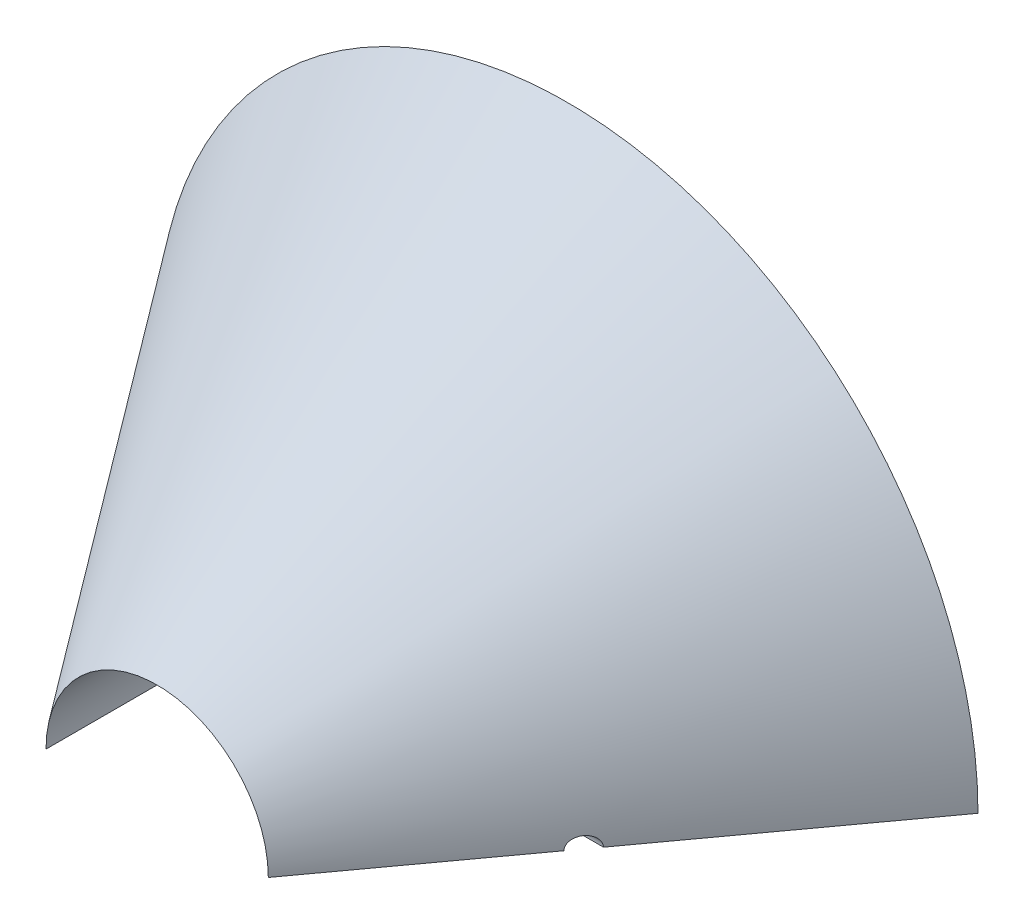
ISO-10303-21;
HEADER;
FILE_DESCRIPTION(('STEP AP214'),'2;1');
FILE_NAME('part.step','',(''),(''),'','','');
FILE_SCHEMA(('AUTOMOTIVE_DESIGN { 1 0 10303 214 1 1 1 1 }'));
ENDSEC;
DATA;
#1=APPLICATION_CONTEXT('core data for automotive mechanical design processes');
#2=APPLICATION_PROTOCOL_DEFINITION('international standard','automotive_design',2000,#1);
#3=PRODUCT_CONTEXT('',#1,'mechanical');
#4=PRODUCT('Part','Part','',(#3));
#5=PRODUCT_RELATED_PRODUCT_CATEGORY('part','',(#4));
#6=PRODUCT_DEFINITION_FORMATION('','',#4);
#7=PRODUCT_DEFINITION_CONTEXT('part definition',#1,'design');
#8=PRODUCT_DEFINITION('design','',#6,#7);
#9=PRODUCT_DEFINITION_SHAPE('','',#8);
#10=(LENGTH_UNIT() NAMED_UNIT(*) SI_UNIT(.MILLI.,.METRE.));
#11=(NAMED_UNIT(*) PLANE_ANGLE_UNIT() SI_UNIT($,.RADIAN.));
#12=(NAMED_UNIT(*) SI_UNIT($,.STERADIAN.) SOLID_ANGLE_UNIT());
#13=UNCERTAINTY_MEASURE_WITH_UNIT(LENGTH_MEASURE(1.E-05),#10,'distance_accuracy_value','');
#14=(GEOMETRIC_REPRESENTATION_CONTEXT(3) GLOBAL_UNCERTAINTY_ASSIGNED_CONTEXT((#13)) GLOBAL_UNIT_ASSIGNED_CONTEXT((#10,
#11,#12)) REPRESENTATION_CONTEXT('',''));
#15=CARTESIAN_POINT('',(0.,0.,0.));
#16=DIRECTION('',(0.,0.,1.));
#17=DIRECTION('',(1.,0.,0.));
#18=AXIS2_PLACEMENT_3D('',#15,#16,#17);
#19=CARTESIAN_POINT('',(0.,0.,0.));
#20=DIRECTION('',(0.,1.,0.));
#21=DIRECTION('',(0.,0.,1.));
#22=AXIS2_PLACEMENT_3D('',#19,#20,#21);
#23=PLANE('',#22);
#24=DIRECTION('',(0.,0.,1.));
#25=VECTOR('',#24,1.);
#26=CARTESIAN_POINT('',(-48.75,0.,180.));
#27=LINE('',#26,#25);
#28=CARTESIAN_POINT('',(-48.75,0.,180.));
#29=VERTEX_POINT('',#28);
#30=CARTESIAN_POINT('',(-48.75,0.,0.));
#31=VERTEX_POINT('',#30);
#32=EDGE_CURVE('E92',#29,#31,#27,.F.);
#33=ORIENTED_EDGE('',*,*,#32,.F.);
#34=DIRECTION('',(0.589172157449442,0.,0.808007530216377));
#35=VECTOR('',#34,1.);
#36=CARTESIAN_POINT('',(0.,0.,246.857142857143));
#37=LINE('',#36,#35);
#38=CARTESIAN_POINT('',(-180.,0.,0.));
#39=VERTEX_POINT('',#38);
#40=EDGE_CURVE('E181',#39,#29,#37,.T.);
#41=ORIENTED_EDGE('',*,*,#40,.F.);
#42=DIRECTION('',(-1.,0.,0.));
#43=VECTOR('',#42,1.);
#44=CARTESIAN_POINT('',(0.,0.,0.));
#45=LINE('',#44,#43);
#46=EDGE_CURVE('E178',#31,#39,#45,.T.);
#47=ORIENTED_EDGE('',*,*,#46,.F.);
#48=EDGE_LOOP('',(#33,#41,#47));
#49=FACE_BOUND('',#48,.T.);
#50=ADVANCED_FACE('F34',(#49),#23,.F.);
#51=CARTESIAN_POINT('',(0.,0.,180.));
#52=DIRECTION('',(0.,0.,1.));
#53=DIRECTION('',(1.,0.,0.));
#54=AXIS2_PLACEMENT_3D('',#51,#52,#53);
#55=CYLINDRICAL_SURFACE('',#54,48.75);
#56=CARTESIAN_POINT('',(0.,0.,180.));
#57=DIRECTION('',(0.,0.,1.));
#58=DIRECTION('',(1.,0.,0.));
#59=AXIS2_PLACEMENT_3D('',#56,#57,#58);
#60=CIRCLE('',#59,48.75);
#61=CARTESIAN_POINT('',(48.75,0.,180.));
#62=VERTEX_POINT('',#61);
#63=EDGE_CURVE('E98',#62,#29,#60,.T.);
#64=ORIENTED_EDGE('',*,*,#63,.T.);
#65=ORIENTED_EDGE('',*,*,#32,.T.);
#66=CARTESIAN_POINT('',(0.,0.,0.));
#67=DIRECTION('',(0.,0.,1.));
#68=DIRECTION('',(1.,0.,0.));
#69=AXIS2_PLACEMENT_3D('',#66,#67,#68);
#70=CIRCLE('',#69,48.75);
#71=CARTESIAN_POINT('',(48.75,0.,0.));
#72=VERTEX_POINT('',#71);
#73=EDGE_CURVE('E103',#72,#31,#70,.T.);
#74=ORIENTED_EDGE('',*,*,#73,.F.);
#75=DIRECTION('',(0.,0.,1.));
#76=VECTOR('',#75,1.);
#77=CARTESIAN_POINT('',(48.75,0.,180.));
#78=LINE('',#77,#76);
#79=CARTESIAN_POINT('',(48.75,0.,95.));
#80=VERTEX_POINT('',#79);
#81=EDGE_CURVE('E177',#72,#80,#78,.T.);
#82=ORIENTED_EDGE('',*,*,#81,.T.);
#83=CARTESIAN_POINT('',(48.75,0.,95.));
#84=CARTESIAN_POINT('',(48.750000389197,-0.14008100086284,94.9999986018309));
#85=CARTESIAN_POINT('',(48.7493950083053,-0.280140737873493,95.0058890159541));
#86=CARTESIAN_POINT('',(48.7469912287984,-0.559305925529234,95.0294068089419));
#87=CARTESIAN_POINT('',(48.7451925455075,-0.698411140459885,95.0470369884638));
#88=CARTESIAN_POINT('',(48.7404503592909,-0.974737830645201,95.0939279402502));
#89=CARTESIAN_POINT('',(48.737505949223,-1.11195772382351,95.1231979288691));
#90=CARTESIAN_POINT('',(48.7305544431504,-1.38347878134987,95.1931665631875));
#91=CARTESIAN_POINT('',(48.7265469582316,-1.51777885802131,95.2338693917857));
#92=CARTESIAN_POINT('',(48.7175873522136,-1.7823254585363,95.3263577551216));
#93=CARTESIAN_POINT('',(48.7126361631751,-1.91257583570178,95.3781323607879));
#94=CARTESIAN_POINT('',(48.701923936988,-2.16829177987035,95.4924361395613));
#95=CARTESIAN_POINT('',(48.696162601784,-2.2937555641763,95.5549692726647));
#96=CARTESIAN_POINT('',(48.6839968800058,-2.5388978794622,95.6902913994103));
#97=CARTESIAN_POINT('',(48.6775928619544,-2.65857966824321,95.7630745251197));
#98=CARTESIAN_POINT('',(48.6643161559048,-2.89144274282538,95.9184369559612));
#99=CARTESIAN_POINT('',(48.6574432951223,-3.00462160346189,96.0010198810297));
#100=CARTESIAN_POINT('',(48.6434027571373,-3.22397034323184,96.1756405164407));
#101=CARTESIAN_POINT('',(48.6362342596262,-3.33011824606443,96.2677057671708));
#102=CARTESIAN_POINT('',(48.6218213751467,-3.53432740876358,96.4604728753795));
#103=CARTESIAN_POINT('',(48.614576961105,-3.63238566486568,96.5611779128343));
#104=CARTESIAN_POINT('',(48.600221908122,-3.8196530425597,96.7704550377934));
#105=CARTESIAN_POINT('',(48.5931112269238,-3.90886499881192,96.8790245858134));
#106=CARTESIAN_POINT('',(48.5792198977998,-4.07787800390798,97.1033399806117));
#107=CARTESIAN_POINT('',(48.5724393726231,-4.15767556801212,97.219088460637));
#108=CARTESIAN_POINT('',(48.5593915128267,-4.30739554051586,97.4571373901257));
#109=CARTESIAN_POINT('',(48.55312516295,-4.37729917752714,97.5794497025295));
#110=CARTESIAN_POINT('',(48.5412967585839,-4.50657563732373,97.8296061375659));
#111=CARTESIAN_POINT('',(48.5357349658752,-4.56594454916064,97.9574522927828));
#112=CARTESIAN_POINT('',(48.5254804614672,-4.67366907148744,98.217689519941));
#113=CARTESIAN_POINT('',(48.5207874115692,-4.7220289694427,98.3500787993653));
#114=CARTESIAN_POINT('',(48.5124001208882,-4.80742627588238,98.6185052355794));
#115=CARTESIAN_POINT('',(48.5087062478272,-4.84445951652841,98.7545437151754));
#116=CARTESIAN_POINT('',(48.4993223283529,-4.93785036616057,99.1656124433031));
#117=CARTESIAN_POINT('',(48.4952805494567,-4.97700104155831,99.4448123428154));
#118=CARTESIAN_POINT('',(48.4920997750474,-5.00789044245951,100.005695122123));
#119=CARTESIAN_POINT('',(48.4929606443874,-4.99963047488887,100.287377933261));
#120=CARTESIAN_POINT('',(48.4994651170514,-4.9361304439657,100.84428299938));
#121=CARTESIAN_POINT('',(48.5050904528067,-4.88106981740609,101.119525809727));
#122=CARTESIAN_POINT('',(48.5204637315776,-4.72579415216424,101.65683235715));
#123=CARTESIAN_POINT('',(48.5302117328848,-4.62557847502081,101.918895907822));
#124=CARTESIAN_POINT('',(48.5527523909515,-4.38264425232442,102.422984278809));
#125=CARTESIAN_POINT('',(48.5655507320491,-4.23984622785899,102.664970536143));
#126=CARTESIAN_POINT('',(48.5927454108909,-3.91585672545949,103.12160957111));
#127=CARTESIAN_POINT('',(48.6071417978411,-3.73466406514936,103.336261506646));
#128=CARTESIAN_POINT('',(48.6359918294384,-3.3380272417351,103.733182554229));
#129=CARTESIAN_POINT('',(48.6504454299169,-3.12242809707303,103.915296835475));
#130=CARTESIAN_POINT('',(48.6777183357708,-2.66363602583515,104.24077219106));
#131=CARTESIAN_POINT('',(48.6905376391663,-2.42044306583126,104.384133218452));
#132=CARTESIAN_POINT('',(48.7131020876591,-1.91325834758283,104.628027014304));
#133=CARTESIAN_POINT('',(48.7228466565943,-1.64926270277589,104.728551757082));
#134=CARTESIAN_POINT('',(48.7381578744169,-1.10801780887595,104.883805091289));
#135=CARTESIAN_POINT('',(48.7437246547517,-0.830768977065377,104.938535123583));
#136=CARTESIAN_POINT('',(48.7500361632012,-0.272228441535443,105.00044864221));
#137=CARTESIAN_POINT('',(48.7508025560036,0.00903934777978221,105.007845750611));
#138=CARTESIAN_POINT('',(48.7474850668982,0.568810634624786,104.975444758929));
#139=CARTESIAN_POINT('',(48.7434012539818,0.847314171417597,104.93564733016));
#140=CARTESIAN_POINT('',(48.7308560801636,1.39303341447142,104.81016423428));
#141=CARTESIAN_POINT('',(48.7224042785875,1.66027239745354,104.724578759789));
#142=CARTESIAN_POINT('',(48.7020711161284,2.17660055900645,104.510052035007));
#143=CARTESIAN_POINT('',(48.6901896745848,2.42568931053593,104.381109765012));
#144=CARTESIAN_POINT('',(48.6642718407333,2.8996110877734,104.083001330848));
#145=CARTESIAN_POINT('',(48.6502280017268,3.12435554042963,103.913695015106));
#146=CARTESIAN_POINT('',(48.621584691777,3.54231194552546,103.539864177106));
#147=CARTESIAN_POINT('',(48.606985206158,3.73552306438865,103.335338724132));
#148=CARTESIAN_POINT('',(48.5788106240481,4.08567185517549,102.895946149536));
#149=CARTESIAN_POINT('',(48.5652396221104,4.24246919531283,102.660966909692));
#150=CARTESIAN_POINT('',(48.5407216552142,4.51437295777038,102.167875136452));
#151=CARTESIAN_POINT('',(48.5297746527683,4.62947997570706,101.909762933614));
#152=CARTESIAN_POINT('',(48.511768592767,4.8145067034086,101.378263175584));
#153=CARTESIAN_POINT('',(48.5047023901735,4.88450949714478,101.104904720184));
#154=CARTESIAN_POINT('',(48.4952408395981,4.97759035860086,100.550083631075));
#155=CARTESIAN_POINT('',(48.4928453500628,5.00066984840871,100.268621243232));
#156=CARTESIAN_POINT('',(48.4929473956605,4.99964290141229,99.8474570227359));
#157=CARTESIAN_POINT('',(48.4935928392565,4.99340252271699,99.7074908372863));
#158=CARTESIAN_POINT('',(48.4960784705341,4.96921054801502,99.4285989653847));
#159=CARTESIAN_POINT('',(48.4979182145855,4.95126330058479,99.2896729119443));
#160=CARTESIAN_POINT('',(48.5027427204151,4.90377491789048,99.0137948239799));
#161=CARTESIAN_POINT('',(48.5057279015383,4.87422953645153,98.8768435314916));
#162=CARTESIAN_POINT('',(48.5127559314431,4.80377618536093,98.6059744620394));
#163=CARTESIAN_POINT('',(48.5167983936194,4.76287236869493,98.4720555956482));
#164=CARTESIAN_POINT('',(48.525827445254,4.66998352416419,98.2081206581476));
#165=CARTESIAN_POINT('',(48.5308142285033,4.6179962215002,98.0781053944811));
#166=CARTESIAN_POINT('',(48.5415877348515,4.50334014269483,97.8229651191824));
#167=CARTESIAN_POINT('',(48.5473741657096,4.4406752668614,97.6978383423255));
#168=CARTESIAN_POINT('',(48.5595869146512,4.30507283476307,97.453255580476));
#169=CARTESIAN_POINT('',(48.5660134594491,4.23213163503253,97.3338016269521));
#170=CARTESIAN_POINT('',(48.5793210747985,4.0765372254649,97.1014861820133));
#171=CARTESIAN_POINT('',(48.5862019798918,3.99388754258636,96.9886223186799));
#172=CARTESIAN_POINT('',(48.6002611013155,3.8190116579077,96.7696946920308));
#173=CARTESIAN_POINT('',(48.6074405953638,3.72674104488739,96.6636664823935));
#174=CARTESIAN_POINT('',(48.6218597096454,3.5336420168319,96.4597909416014));
#175=CARTESIAN_POINT('',(48.6290993069958,3.4328167350974,96.3619406409847));
#176=CARTESIAN_POINT('',(48.6434412404114,3.22322228659948,96.1750073996124));
#177=CARTESIAN_POINT('',(48.650543490368,3.1144483284338,96.0859298242102));
#178=CARTESIAN_POINT('',(48.6644030484974,2.88981516863571,95.9172695742775));
#179=CARTESIAN_POINT('',(48.6711604830766,2.77395859816484,95.8376834057625));
#180=CARTESIAN_POINT('',(48.6841620584364,2.53557744063651,95.6883076711548));
#181=CARTESIAN_POINT('',(48.6904045927547,2.41303383009732,95.6185483180658));
#182=CARTESIAN_POINT('',(48.7021740092982,2.16251348650119,95.4896370889704));
#183=CARTESIAN_POINT('',(48.7077011534379,2.03453876476771,95.4304813277677));
#184=CARTESIAN_POINT('',(48.7178810869501,1.77412573229979,95.3232180732733));
#185=CARTESIAN_POINT('',(48.7225345887302,1.64169116318527,95.275101570895));
#186=CARTESIAN_POINT('',(48.7308395507551,1.37324976919271,95.1902179849387));
#187=CARTESIAN_POINT('',(48.734491256199,1.23724382738741,95.1534481238882));
#188=CARTESIAN_POINT('',(48.7416578208933,0.919647422003384,95.0818324431433));
#189=CARTESIAN_POINT('',(48.7447736658721,0.737087728326719,95.0511749660776));
#190=CARTESIAN_POINT('',(48.7489444941515,0.36967301153783,95.0102597116689));
#191=CARTESIAN_POINT('',(48.749999486507,0.184817998514194,95.0000018446957));
#192=CARTESIAN_POINT('',(48.75,0.,95.));
#193=B_SPLINE_CURVE_WITH_KNOTS('',3,(#83,#84,#85,#86,#87,#88,#89,#90,#91,#92,#93,#94,#95,#96,
#97,#98,#99,#100,#101,#102,#103,#104,#105,#106,#107,#108,#109,#110,#111,#112,#113,#114,#115,
#116,#117,#118,#119,#120,#121,#122,#123,#124,#125,#126,#127,#128,#129,#130,#131,#132,#133,#134,
#135,#136,#137,#138,#139,#140,#141,#142,#143,#144,#145,#146,#147,#148,#149,#150,#151,#152,#153,
#154,#155,#156,#157,#158,#159,#160,#161,#162,#163,#164,#165,#166,#167,#168,#169,#170,#171,#172,
#173,#174,#175,#176,#177,#178,#179,#180,#181,#182,#183,#184,#185,#186,#187,#188,#189,#190,#191,
#192),.UNSPECIFIED.,.T.,.F.,(4,2,2,2,2,2,2,2,2,2,2,2,2,2,2,2,2,2,2,2,2,2,2,2,2,2,2,2,2,2,2,2,2,
2,2,2,2,2,2,2,2,2,2,2,2,2,2,2,2,2,2,2,2,2,4),(0.,0.420081372263408,0.840262995736704,
1.26077798189679,1.68144702145216,2.1017027151597,2.52211342872985,2.9422844359281,
3.36261113558632,3.78419502857095,4.20593476173172,4.62753891521351,5.04929863919035,
5.47184812352873,5.89455414991491,6.31709527054133,6.7397916859001,7.58128440501172,
8.42275392757352,9.26101167859738,10.0992812823782,10.939125394758,11.7789953741871,
12.62276120516,13.4665280583104,14.3104529277644,15.1543512433517,15.9944381904937,
16.8345131880398,17.6727574216204,18.5110213711709,19.352239444942,20.1934797525183,
21.0379101468124,21.8823284765202,22.7251868695829,23.5680197180541,23.9879313067028,
24.4076870057928,24.8275965245294,25.2473527134102,25.6671951370627,26.086884528002,
26.5067230958436,26.92640961108,27.3481272649718,27.7696911185456,28.1915112178113,
28.6131755538511,29.0361092707313,29.458887704913,29.8813198745028,30.3036485574235,
30.8578917387347,31.4121324848502),.UNSPECIFIED.);
#194=CARTESIAN_POINT('',(48.75,0.,105.));
#195=VERTEX_POINT('',#194);
#196=EDGE_CURVE('E91',#195,#80,#193,.T.);
#197=ORIENTED_EDGE('',*,*,#196,.F.);
#198=EDGE_CURVE('E50',#195,#62,#78,.T.);
#199=ORIENTED_EDGE('',*,*,#198,.T.);
#200=EDGE_LOOP('',(#64,#65,#74,#82,#197,#199));
#201=FACE_BOUND('',#200,.T.);
#202=ADVANCED_FACE('F36',(#201),#55,.F.);
#203=CARTESIAN_POINT('',(0.,0.,0.));
#204=DIRECTION('',(0.,0.,-1.));
#205=DIRECTION('',(-1.,0.,0.));
#206=AXIS2_PLACEMENT_3D('',#203,#204,#205);
#207=CONICAL_SURFACE('',#206,180.,0.630033909545915);
#208=ORIENTED_EDGE('',*,*,#63,.F.);
#209=DIRECTION('',(0.589172157449442,0.,-0.808007530216377));
#210=VECTOR('',#209,1.);
#211=CARTESIAN_POINT('',(0.,0.,246.857142857143));
#212=LINE('',#211,#210);
#213=CARTESIAN_POINT('',(103.4375,0.,105.));
#214=VERTEX_POINT('',#213);
#215=EDGE_CURVE('E95',#62,#214,#212,.T.);
#216=ORIENTED_EDGE('',*,*,#215,.T.);
#217=CARTESIAN_POINT('',(103.984458415502,-2.71070320161313,104.201438819353));
#218=CARTESIAN_POINT('',(103.940710152939,-2.61229231644573,104.264933142465));
#219=CARTESIAN_POINT('',(103.899112602503,-2.51098517642877,104.32539541103));
#220=CARTESIAN_POINT('',(103.820600442907,-2.30294989717016,104.439650459376));
#221=CARTESIAN_POINT('',(103.783684846781,-2.19622290710788,104.493444644747));
#222=CARTESIAN_POINT('',(103.714886216869,-1.97773271987816,104.593804358103));
#223=CARTESIAN_POINT('',(103.683007533823,-1.86596527485606,104.640363636218));
#224=CARTESIAN_POINT('',(103.624698441801,-1.63813753098462,104.725599396526));
#225=CARTESIAN_POINT('',(103.598265619527,-1.52207916063957,104.764279370294));
#226=CARTESIAN_POINT('',(103.551051687983,-1.28580865093077,104.833416516934));
#227=CARTESIAN_POINT('',(103.530297091497,-1.16557988328282,104.863835111087));
#228=CARTESIAN_POINT('',(103.494887586611,-0.922376455113686,104.915757842227));
#229=CARTESIAN_POINT('',(103.480230228949,-0.799402918123277,104.937265558699));
#230=CARTESIAN_POINT('',(103.457212986615,-0.551629058519088,104.971049767359));
#231=CARTESIAN_POINT('',(103.44885206846,-0.426829039129523,104.983327774489));
#232=CARTESIAN_POINT('',(103.438547156485,-0.176397811429772,104.998461512356));
#233=CARTESIAN_POINT('',(103.436602823791,-0.0507666473652462,105.001317740678));
#234=CARTESIAN_POINT('',(103.439083102795,0.19290302141914,104.997674773743));
#235=CARTESIAN_POINT('',(103.443140162064,0.310953868374315,104.991715480335));
#236=CARTESIAN_POINT('',(103.456911296634,0.546049651999109,104.971494091243));
#237=CARTESIAN_POINT('',(103.46662727066,0.663094237657593,104.9572292088));
#238=CARTESIAN_POINT('',(103.491587874049,0.895260567369744,104.920601033937));
#239=CARTESIAN_POINT('',(103.506830368835,1.01038303589298,104.898240868266));
#240=CARTESIAN_POINT('',(103.542661368094,1.23802517061115,104.845714208637));
#241=CARTESIAN_POINT('',(103.563251909677,1.35054382716937,104.815544740073));
#242=CARTESIAN_POINT('',(103.609520435724,1.57217015213002,104.747809431295));
#243=CARTESIAN_POINT('',(103.63519489784,1.6812801219498,104.710248712153));
#244=CARTESIAN_POINT('',(103.69135768952,1.89558801995827,104.628167337065));
#245=CARTESIAN_POINT('',(103.721847713757,2.00078455478346,104.583644230998));
#246=CARTESIAN_POINT('',(103.820076135915,2.30966044472652,104.440370473503));
#247=CARTESIAN_POINT('',(103.894605279611,2.50677892717922,104.3318678511));
#248=CARTESIAN_POINT('',(104.067084158432,2.89837944764943,104.081499269281));
#249=CARTESIAN_POINT('',(104.166610279001,3.09072422809052,103.937409955628));
#250=CARTESIAN_POINT('',(104.38082833992,3.44827281527613,103.628402473468));
#251=CARTESIAN_POINT('',(104.495527940382,3.61346281823014,103.463473786403));
#252=CARTESIAN_POINT('',(104.756462714437,3.94012725927042,103.089742458919));
#253=CARTESIAN_POINT('',(104.904801938981,4.09672109560923,102.878151310574));
#254=CARTESIAN_POINT('',(105.213605024728,4.37201650188717,102.439788479745));
#255=CARTESIAN_POINT('',(105.374076316736,4.49069461234763,102.213007503456));
#256=CARTESIAN_POINT('',(105.733761439532,4.70899131697108,101.707182946707));
#257=CARTESIAN_POINT('',(105.934701062432,4.80117875032557,101.426154702186));
#258=CARTESIAN_POINT('',(106.343772636994,4.93461218825182,100.857345875523));
#259=CARTESIAN_POINT('',(106.551908527052,4.97582982932774,100.569561624498));
#260=CARTESIAN_POINT('',(107.002230706905,5.01073449771237,99.9504170406677));
#261=CARTESIAN_POINT('',(107.244882559442,4.99645201245636,99.6189335447323));
#262=CARTESIAN_POINT('',(107.728064691258,4.9024794037955,98.9629138532056));
#263=CARTESIAN_POINT('',(107.968592290743,4.82271606018008,98.6383858522362));
#264=CARTESIAN_POINT('',(108.327576554776,4.65116554144732,98.1567578930231));
#265=CARTESIAN_POINT('',(108.449603657311,4.58320504464219,97.9935421441669));
#266=CARTESIAN_POINT('',(108.689962917362,4.42905200962663,97.6729577941818));
#267=CARTESIAN_POINT('',(108.808294413299,4.34285622820769,97.5155902390355));
#268=CARTESIAN_POINT('',(109.039669186551,4.15225482019592,97.208702375639));
#269=CARTESIAN_POINT('',(109.152722095788,4.04788414747182,97.0591677085126));
#270=CARTESIAN_POINT('',(109.372224473872,3.82073453410554,96.7695406890657));
#271=CARTESIAN_POINT('',(109.47867449444,3.69795713442162,96.6294475477497));
#272=CARTESIAN_POINT('',(109.718037851861,3.38901131950929,96.3151322708466));
#273=CARTESIAN_POINT('',(109.847648487688,3.19548066690098,96.1454938638345));
#274=CARTESIAN_POINT('',(110.086494383742,2.77660406443886,95.833645570296));
#275=CARTESIAN_POINT('',(110.195758790032,2.55130445014785,95.691396438414));
#276=CARTESIAN_POINT('',(110.373471681238,2.10831344011402,95.4604573146488));
#277=CARTESIAN_POINT('',(110.445600418646,1.89467635220449,95.3669119380516));
#278=CARTESIAN_POINT('',(110.536817526026,1.56186921256396,95.2487382651109));
#279=CARTESIAN_POINT('',(110.564400652037,1.44883270259665,95.2130290552202));
#280=CARTESIAN_POINT('',(110.613504215064,1.21930051042701,95.1494886398799));
#281=CARTESIAN_POINT('',(110.635027180791,1.10280629351304,95.1216541485377));
#282=CARTESIAN_POINT('',(110.671750596817,0.866526814478904,95.0741769648894));
#283=CARTESIAN_POINT('',(110.686917216094,0.746727471169517,95.0545781044819));
#284=CARTESIAN_POINT('',(110.710488307072,0.505410819972867,95.024124112204));
#285=CARTESIAN_POINT('',(110.718895685655,0.383894273490889,95.0132652216161));
#286=CARTESIAN_POINT('',(110.728800014348,0.140110970194743,95.0004732904261));
#287=CARTESIAN_POINT('',(110.730297004349,0.0178442177152859,94.9985401982991));
#288=CARTESIAN_POINT('',(110.72635244841,-0.22638334146736,95.0036344664669));
#289=CARTESIAN_POINT('',(110.720911323922,-0.348344166303044,95.0106612824977));
#290=CARTESIAN_POINT('',(110.703927944624,-0.580877180075577,95.0325997981357));
#291=CARTESIAN_POINT('',(110.69292838713,-0.691555927002531,95.0468101700464));
#292=CARTESIAN_POINT('',(110.66535660826,-0.911053147491465,95.0824429398805));
#293=CARTESIAN_POINT('',(110.648782604064,-1.01987101419158,95.1038676450957));
#294=CARTESIAN_POINT('',(110.591047489148,-1.34239889760392,95.1785340734845));
#295=CARTESIAN_POINT('',(110.541857610061,-1.55238988212975,95.2421882979282));
#296=CARTESIAN_POINT('',(110.422465798715,-1.96523475301935,95.3969146748232));
#297=CARTESIAN_POINT('',(110.35153432919,-2.16751137805414,95.4889395493118));
#298=CARTESIAN_POINT('',(110.192725495089,-2.55304128665783,95.6953708823547));
#299=CARTESIAN_POINT('',(110.104841169738,-2.73628670838206,95.8097865347525));
#300=CARTESIAN_POINT('',(109.901072868682,-3.10795747826696,96.0756689022859));
#301=CARTESIAN_POINT('',(109.782965717195,-3.2930172975676,96.2301199730906));
#302=CARTESIAN_POINT('',(109.53288015376,-3.63451998591007,96.5581377072116));
#303=CARTESIAN_POINT('',(109.400893047563,-3.79094474813214,96.7317163551259));
#304=CARTESIAN_POINT('',(109.098561979716,-4.10407732519965,97.1306268141172));
#305=CARTESIAN_POINT('',(108.925893135083,-4.25430391034733,97.3592838324198));
#306=CARTESIAN_POINT('',(108.570665376046,-4.51346437036094,97.8317412778158));
#307=CARTESIAN_POINT('',(108.388100196795,-4.62237173093297,98.075551312135));
#308=CARTESIAN_POINT('',(107.981168527921,-4.81655089796354,98.6215197515161));
#309=CARTESIAN_POINT('',(107.755548490112,-4.89317296048507,98.925840575887));
#310=CARTESIAN_POINT('',(107.301637389169,-4.9887041704776,99.5416762989334));
#311=CARTESIAN_POINT('',(107.073344216557,-5.00756415308837,99.8531970988781));
#312=CARTESIAN_POINT('',(106.594870867599,-4.98589197577594,100.510063954498));
#313=CARTESIAN_POINT('',(106.34498528373,-4.93873572997116,100.855434954895));
#314=CARTESIAN_POINT('',(105.855891937608,-4.77110646764184,101.53600070705));
#315=CARTESIAN_POINT('',(105.616680681954,-4.65065762938292,101.871198776456));
#316=CARTESIAN_POINT('',(105.20556794218,-4.36732177796837,102.451044234308));
#317=CARTESIAN_POINT('',(105.030048113206,-4.21856683457454,102.699974305601));
#318=CARTESIAN_POINT('',(104.780101722293,-3.95996155027685,103.056175070766));
#319=CARTESIAN_POINT('',(104.699072500086,-3.8679420475178,103.171950672504));
#320=CARTESIAN_POINT('',(104.542111946771,-3.67210145065501,103.396743570942));
#321=CARTESIAN_POINT('',(104.466178381727,-3.56828558255705,103.505763827559));
#322=CARTESIAN_POINT('',(104.318206604624,-3.34600683017264,103.718679274712));
#323=CARTESIAN_POINT('',(104.24633292108,-3.22721968412274,103.822351104784));
#324=CARTESIAN_POINT('',(104.109749127355,-2.97771027973184,104.019768770407));
#325=CARTESIAN_POINT('',(104.045041555103,-2.84698382271701,104.113511088843));
#326=CARTESIAN_POINT('',(103.984458415502,-2.71070320161313,104.201438819353));
#327=B_SPLINE_CURVE_WITH_KNOTS('',3,(#217,#218,#219,#220,#221,#222,#223,#224,#225,#226,#227,
#228,#229,#230,#231,#232,#233,#234,#235,#236,#237,#238,#239,#240,#241,#242,#243,#244,#245,#246,
#247,#248,#249,#250,#251,#252,#253,#254,#255,#256,#257,#258,#259,#260,#261,#262,#263,#264,#265,
#266,#267,#268,#269,#270,#271,#272,#273,#274,#275,#276,#277,#278,#279,#280,#281,#282,#283,#284,
#285,#286,#287,#288,#289,#290,#291,#292,#293,#294,#295,#296,#297,#298,#299,#300,#301,#302,#303,
#304,#305,#306,#307,#308,#309,#310,#311,#312,#313,#314,#315,#316,#317,#318,#319,#320,#321,#322,
#323,#324,#325,#326),.UNSPECIFIED.,.T.,.F.,(4,2,2,2,2,2,2,2,2,2,2,2,2,2,2,2,2,2,2,2,2,2,2,2,2,2,
2,2,2,2,2,2,2,2,2,2,2,2,2,2,2,2,2,2,2,2,2,2,2,2,2,2,2,2,4),(0.,0.374943105475142,
0.749807040431102,1.12499302248371,1.50001238405056,1.87675400911221,2.25334415058903,
2.62987246595927,3.00638089574639,3.36076406365179,3.71526620561966,4.06963156936687,
4.42413211196901,4.77838789613848,5.13276862751649,5.84104547041635,6.6184886644882,
7.39632584805654,8.29940173073475,9.20303529345246,10.271583086226,11.3407252336303,
12.5686756761658,13.79800107706,14.441736207024,15.0855859239057,15.7282107982473,
16.3707819038934,17.2317516922097,18.0914784865261,18.8204500891496,19.1851942691776,
19.5497860267665,19.9162943734314,20.2826450149138,20.6489935416019,21.015319815736,
21.3513027523162,21.6873932453457,22.3589570074241,23.0561222314345,23.7535743203226,
24.5559169051543,25.3587650962707,26.3257628574097,27.2933800897954,28.4482095977997,
29.6040217794624,30.8844750294964,32.1645061036137,33.1769946047275,33.6823697498814,
34.1875218711503,34.7065645209401,35.2257904094772),.UNSPECIFIED.);
#328=CARTESIAN_POINT('',(110.729166666667,0.,95.));
#329=VERTEX_POINT('',#328);
#330=EDGE_CURVE('E85',#214,#329,#327,.T.);
#331=ORIENTED_EDGE('',*,*,#330,.T.);
#332=CARTESIAN_POINT('',(180.,0.,0.));
#333=VERTEX_POINT('',#332);
#334=EDGE_CURVE('E101',#329,#333,#212,.T.);
#335=ORIENTED_EDGE('',*,*,#334,.T.);
#336=CARTESIAN_POINT('',(0.,0.,0.));
#337=DIRECTION('',(0.,0.,1.));
#338=DIRECTION('',(1.,0.,0.));
#339=AXIS2_PLACEMENT_3D('',#336,#337,#338);
#340=CIRCLE('',#339,180.);
#341=EDGE_CURVE('E104',#333,#39,#340,.T.);
#342=ORIENTED_EDGE('',*,*,#341,.T.);
#343=ORIENTED_EDGE('',*,*,#40,.T.);
#344=EDGE_LOOP('',(#208,#216,#331,#335,#342,#343));
#345=FACE_BOUND('',#344,.T.);
#346=ADVANCED_FACE('F96',(#345),#207,.T.);
#347=CARTESIAN_POINT('',(0.,48.75,0.));
#348=DIRECTION('',(0.,0.,1.));
#349=DIRECTION('',(1.,0.,0.));
#350=AXIS2_PLACEMENT_3D('',#347,#348,#349);
#351=PLANE('',#350);
#352=ORIENTED_EDGE('',*,*,#341,.F.);
#353=EDGE_CURVE('E58',#333,#72,#45,.T.);
#354=ORIENTED_EDGE('',*,*,#353,.T.);
#355=ORIENTED_EDGE('',*,*,#73,.T.);
#356=ORIENTED_EDGE('',*,*,#46,.T.);
#357=EDGE_LOOP('',(#352,#354,#355,#356));
#358=FACE_BOUND('',#357,.T.);
#359=ADVANCED_FACE('F121',(#358),#351,.F.);
#360=CARTESIAN_POINT('',(180.001,0.,100.));
#361=DIRECTION('',(-1.,0.,0.));
#362=DIRECTION('',(0.,0.,1.));
#363=AXIS2_PLACEMENT_3D('',#360,#361,#362);
#364=CYLINDRICAL_SURFACE('',#363,5.);
#365=DIRECTION('',(-1.,0.,0.));
#366=VECTOR('',#365,1.);
#367=CARTESIAN_POINT('',(180.001,0.,95.));
#368=LINE('',#367,#366);
#369=EDGE_CURVE('E12',#329,#80,#368,.T.);
#370=ORIENTED_EDGE('',*,*,#369,.F.);
#371=ORIENTED_EDGE('',*,*,#330,.F.);
#372=DIRECTION('',(-1.,0.,0.));
#373=VECTOR('',#372,1.);
#374=CARTESIAN_POINT('',(180.001,0.,105.));
#375=LINE('',#374,#373);
#376=EDGE_CURVE('E43',#195,#214,#375,.F.);
#377=ORIENTED_EDGE('',*,*,#376,.F.);
#378=ORIENTED_EDGE('',*,*,#196,.T.);
#379=EDGE_LOOP('',(#370,#371,#377,#378));
#380=FACE_BOUND('',#379,.T.);
#381=ADVANCED_FACE('F87',(#380),#364,.F.);
#382=ORIENTED_EDGE('',*,*,#353,.F.);
#383=ORIENTED_EDGE('',*,*,#334,.F.);
#384=ORIENTED_EDGE('',*,*,#369,.T.);
#385=ORIENTED_EDGE('',*,*,#81,.F.);
#386=EDGE_LOOP('',(#382,#383,#384,#385));
#387=FACE_BOUND('',#386,.T.);
#388=ADVANCED_FACE('F120',(#387),#23,.F.);
#389=ORIENTED_EDGE('',*,*,#198,.F.);
#390=ORIENTED_EDGE('',*,*,#376,.T.);
#391=ORIENTED_EDGE('',*,*,#215,.F.);
#392=EDGE_LOOP('',(#389,#390,#391));
#393=FACE_BOUND('',#392,.T.);
#394=ADVANCED_FACE('F102',(#393),#23,.F.);
#395=CLOSED_SHELL('',(#50,#202,#346,#359,#381,#388,#394));
#396=MANIFOLD_SOLID_BREP('B2',#395);
#397=ADVANCED_BREP_SHAPE_REPRESENTATION('',(#18,#396),#14);
#398=SHAPE_DEFINITION_REPRESENTATION(#9,#397);
ENDSEC;
END-ISO-10303-21;
